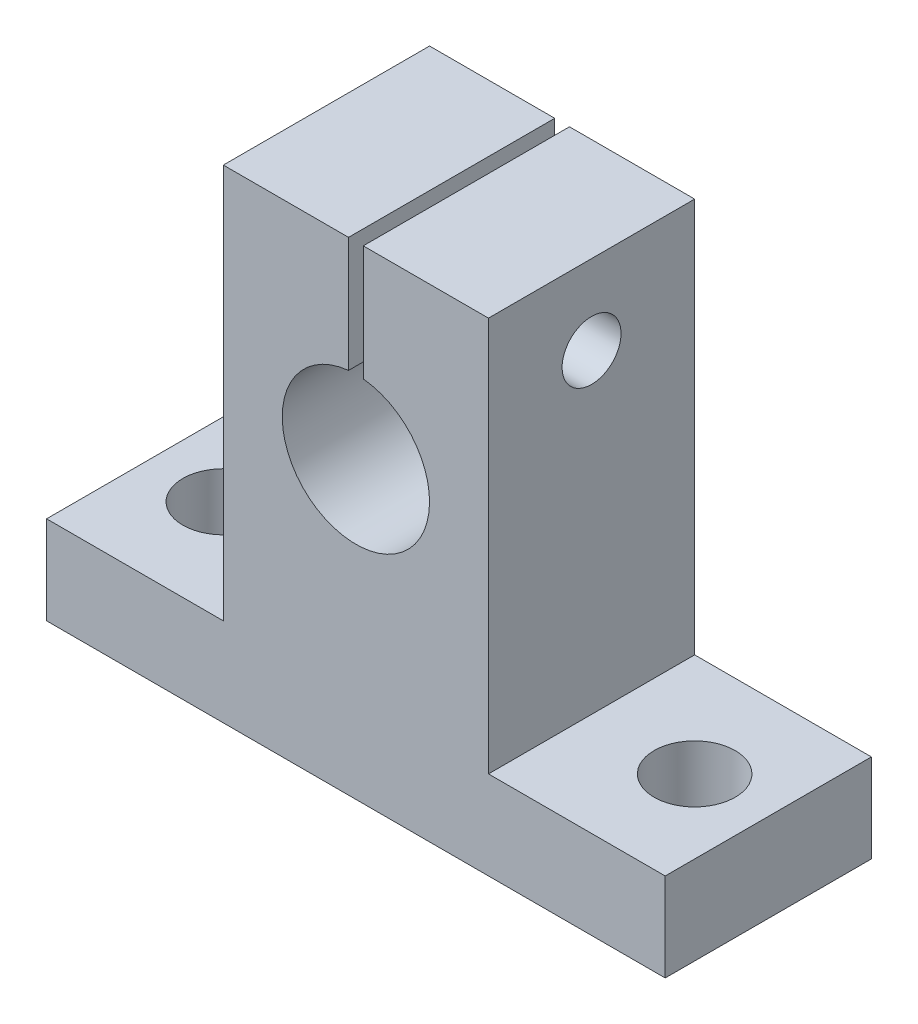
ISO-10303-21;
HEADER;
FILE_DESCRIPTION(('STEP AP214'),'2;1');
FILE_NAME('part.step','',(''),(''),'','','');
FILE_SCHEMA(('AUTOMOTIVE_DESIGN { 1 0 10303 214 1 1 1 1 }'));
ENDSEC;
DATA;
#1=APPLICATION_CONTEXT('core data for automotive mechanical design processes');
#2=APPLICATION_PROTOCOL_DEFINITION('international standard','automotive_design',2000,#1);
#3=PRODUCT_CONTEXT('',#1,'mechanical');
#4=PRODUCT('Part','Part','',(#3));
#5=PRODUCT_RELATED_PRODUCT_CATEGORY('part','',(#4));
#6=PRODUCT_DEFINITION_FORMATION('','',#4);
#7=PRODUCT_DEFINITION_CONTEXT('part definition',#1,'design');
#8=PRODUCT_DEFINITION('design','',#6,#7);
#9=PRODUCT_DEFINITION_SHAPE('','',#8);
#10=(LENGTH_UNIT() NAMED_UNIT(*) SI_UNIT(.MILLI.,.METRE.));
#11=(NAMED_UNIT(*) PLANE_ANGLE_UNIT() SI_UNIT($,.RADIAN.));
#12=(NAMED_UNIT(*) SI_UNIT($,.STERADIAN.) SOLID_ANGLE_UNIT());
#13=UNCERTAINTY_MEASURE_WITH_UNIT(LENGTH_MEASURE(1.E-05),#10,'distance_accuracy_value','');
#14=(GEOMETRIC_REPRESENTATION_CONTEXT(3) GLOBAL_UNCERTAINTY_ASSIGNED_CONTEXT((#13)) GLOBAL_UNIT_ASSIGNED_CONTEXT((#10,
#11,#12)) REPRESENTATION_CONTEXT('',''));
#15=CARTESIAN_POINT('',(0.,0.,0.));
#16=DIRECTION('',(0.,0.,1.));
#17=DIRECTION('',(1.,0.,0.));
#18=AXIS2_PLACEMENT_3D('',#15,#16,#17);
#19=CARTESIAN_POINT('',(-9.,13.4,7.));
#20=DIRECTION('',(0.,-1.,0.));
#21=DIRECTION('',(1.,0.,0.));
#22=AXIS2_PLACEMENT_3D('',#19,#20,#21);
#23=PLANE('',#22);
#24=DIRECTION('',(-1.,0.,0.));
#25=VECTOR('',#24,1.);
#26=CARTESIAN_POINT('',(-9.,13.4,7.));
#27=LINE('',#26,#25);
#28=CARTESIAN_POINT('',(-0.500000000000003,13.4,7.));
#29=VERTEX_POINT('',#28);
#30=CARTESIAN_POINT('',(-9.,13.4,7.));
#31=VERTEX_POINT('',#30);
#32=EDGE_CURVE('E214',#29,#31,#27,.T.);
#33=ORIENTED_EDGE('',*,*,#32,.F.);
#34=DIRECTION('',(0.,0.,-1.));
#35=VECTOR('',#34,1.);
#36=CARTESIAN_POINT('',(-0.500000000000002,13.4,7.));
#37=LINE('',#36,#35);
#38=CARTESIAN_POINT('',(-0.500000000000003,13.4,-7.));
#39=VERTEX_POINT('',#38);
#40=EDGE_CURVE('E129',#29,#39,#37,.T.);
#41=ORIENTED_EDGE('',*,*,#40,.T.);
#42=DIRECTION('',(-1.,0.,0.));
#43=VECTOR('',#42,1.);
#44=CARTESIAN_POINT('',(-9.,13.4,-7.));
#45=LINE('',#44,#43);
#46=CARTESIAN_POINT('',(-9.,13.4,-7.));
#47=VERTEX_POINT('',#46);
#48=EDGE_CURVE('E146',#39,#47,#45,.T.);
#49=ORIENTED_EDGE('',*,*,#48,.T.);
#50=DIRECTION('',(0.,0.,-1.));
#51=VECTOR('',#50,1.);
#52=CARTESIAN_POINT('',(-9.,13.4,7.));
#53=LINE('',#52,#51);
#54=EDGE_CURVE('E178',#31,#47,#53,.T.);
#55=ORIENTED_EDGE('',*,*,#54,.F.);
#56=EDGE_LOOP('',(#33,#41,#49,#55));
#57=FACE_BOUND('',#56,.T.);
#58=ADVANCED_FACE('F34',(#57),#23,.F.);
#59=CARTESIAN_POINT('',(0.,0.,7.));
#60=DIRECTION('',(0.,0.,-1.));
#61=DIRECTION('',(-1.,0.,0.));
#62=AXIS2_PLACEMENT_3D('',#59,#60,#61);
#63=PLANE('',#62);
#64=CARTESIAN_POINT('',(0.,0.6,7.));
#65=DIRECTION('',(0.,0.,1.));
#66=DIRECTION('',(1.,0.,0.));
#67=AXIS2_PLACEMENT_3D('',#64,#65,#66);
#68=CIRCLE('',#67,5.);
#69=CARTESIAN_POINT('',(-0.500000000000001,5.5749371855331,7.));
#70=VERTEX_POINT('',#69);
#71=CARTESIAN_POINT('',(0.499999999999999,5.5749371855331,7.));
#72=VERTEX_POINT('',#71);
#73=EDGE_CURVE('E198',#70,#72,#68,.T.);
#74=ORIENTED_EDGE('',*,*,#73,.F.);
#75=DIRECTION('',(0.,-1.,0.));
#76=VECTOR('',#75,1.);
#77=CARTESIAN_POINT('',(-0.500000000000004,16.5999271851901,7.));
#78=LINE('',#77,#76);
#79=EDGE_CURVE('E57',#29,#70,#78,.T.);
#80=ORIENTED_EDGE('',*,*,#79,.F.);
#81=ORIENTED_EDGE('',*,*,#32,.T.);
#82=DIRECTION('',(0.,-1.,0.));
#83=VECTOR('',#82,1.);
#84=CARTESIAN_POINT('',(-9.,13.4,7.));
#85=LINE('',#84,#83);
#86=CARTESIAN_POINT('',(-9.,-13.4,7.));
#87=VERTEX_POINT('',#86);
#88=EDGE_CURVE('E216',#31,#87,#85,.T.);
#89=ORIENTED_EDGE('',*,*,#88,.T.);
#90=DIRECTION('',(-1.,0.,0.));
#91=VECTOR('',#90,1.);
#92=CARTESIAN_POINT('',(-9.,-13.4,7.));
#93=LINE('',#92,#91);
#94=CARTESIAN_POINT('',(-21.,-13.4,7.));
#95=VERTEX_POINT('',#94);
#96=EDGE_CURVE('E218',#87,#95,#93,.T.);
#97=ORIENTED_EDGE('',*,*,#96,.T.);
#98=DIRECTION('',(0.,-1.,0.));
#99=VECTOR('',#98,1.);
#100=CARTESIAN_POINT('',(-21.,-13.4,7.));
#101=LINE('',#100,#99);
#102=CARTESIAN_POINT('',(-21.,-19.4,7.));
#103=VERTEX_POINT('',#102);
#104=EDGE_CURVE('E220',#95,#103,#101,.T.);
#105=ORIENTED_EDGE('',*,*,#104,.T.);
#106=DIRECTION('',(1.,0.,0.));
#107=VECTOR('',#106,1.);
#108=CARTESIAN_POINT('',(-21.,-19.4,7.));
#109=LINE('',#108,#107);
#110=CARTESIAN_POINT('',(21.,-19.4,7.));
#111=VERTEX_POINT('',#110);
#112=EDGE_CURVE('E222',#103,#111,#109,.T.);
#113=ORIENTED_EDGE('',*,*,#112,.T.);
#114=DIRECTION('',(0.,1.,0.));
#115=VECTOR('',#114,1.);
#116=CARTESIAN_POINT('',(21.,-13.4,7.));
#117=LINE('',#116,#115);
#118=CARTESIAN_POINT('',(21.,-13.4,7.));
#119=VERTEX_POINT('',#118);
#120=EDGE_CURVE('E166',#111,#119,#117,.T.);
#121=ORIENTED_EDGE('',*,*,#120,.T.);
#122=DIRECTION('',(-1.,0.,0.));
#123=VECTOR('',#122,1.);
#124=CARTESIAN_POINT('',(9.,-13.4,7.));
#125=LINE('',#124,#123);
#126=CARTESIAN_POINT('',(9.,-13.4,7.));
#127=VERTEX_POINT('',#126);
#128=EDGE_CURVE('E161',#119,#127,#125,.T.);
#129=ORIENTED_EDGE('',*,*,#128,.T.);
#130=DIRECTION('',(0.,1.,0.));
#131=VECTOR('',#130,1.);
#132=CARTESIAN_POINT('',(9.,13.4,7.));
#133=LINE('',#132,#131);
#134=CARTESIAN_POINT('',(9.,13.4,7.));
#135=VERTEX_POINT('',#134);
#136=EDGE_CURVE('E212',#127,#135,#133,.T.);
#137=ORIENTED_EDGE('',*,*,#136,.T.);
#138=CARTESIAN_POINT('',(0.499999999999997,13.4,7.));
#139=VERTEX_POINT('',#138);
#140=EDGE_CURVE('E199',#135,#139,#27,.T.);
#141=ORIENTED_EDGE('',*,*,#140,.T.);
#142=DIRECTION('',(0.,1.,0.));
#143=VECTOR('',#142,1.);
#144=CARTESIAN_POINT('',(0.499999999999996,16.5999271851901,7.));
#145=LINE('',#144,#143);
#146=EDGE_CURVE('E124',#72,#139,#145,.T.);
#147=ORIENTED_EDGE('',*,*,#146,.F.);
#148=EDGE_LOOP('',(#74,#80,#81,#89,#97,#105,#113,#121,#129,#137,#141,#147));
#149=FACE_BOUND('',#148,.T.);
#150=ADVANCED_FACE('F197',(#149),#63,.F.);
#151=CARTESIAN_POINT('',(0.,0.,-7.));
#152=DIRECTION('',(0.,0.,-1.));
#153=DIRECTION('',(-1.,0.,0.));
#154=AXIS2_PLACEMENT_3D('',#151,#152,#153);
#155=PLANE('',#154);
#156=DIRECTION('',(0.,-1.,0.));
#157=VECTOR('',#156,1.);
#158=CARTESIAN_POINT('',(-0.500000000000004,16.5999271851901,-7.));
#159=LINE('',#158,#157);
#160=CARTESIAN_POINT('',(-0.500000000000001,5.5749371855331,-7.));
#161=VERTEX_POINT('',#160);
#162=EDGE_CURVE('E139',#39,#161,#159,.T.);
#163=ORIENTED_EDGE('',*,*,#162,.T.);
#164=CARTESIAN_POINT('',(0.,0.6,-7.));
#165=DIRECTION('',(0.,0.,1.));
#166=DIRECTION('',(1.,0.,0.));
#167=AXIS2_PLACEMENT_3D('',#164,#165,#166);
#168=CIRCLE('',#167,5.);
#169=CARTESIAN_POINT('',(0.499999999999999,5.5749371855331,-7.));
#170=VERTEX_POINT('',#169);
#171=EDGE_CURVE('E138',#161,#170,#168,.T.);
#172=ORIENTED_EDGE('',*,*,#171,.T.);
#173=DIRECTION('',(0.,1.,0.));
#174=VECTOR('',#173,1.);
#175=CARTESIAN_POINT('',(0.499999999999996,16.5999271851901,-7.));
#176=LINE('',#175,#174);
#177=CARTESIAN_POINT('',(0.499999999999997,13.4,-7.));
#178=VERTEX_POINT('',#177);
#179=EDGE_CURVE('E50',#170,#178,#176,.T.);
#180=ORIENTED_EDGE('',*,*,#179,.T.);
#181=CARTESIAN_POINT('',(9.,13.4,-7.));
#182=VERTEX_POINT('',#181);
#183=EDGE_CURVE('E136',#182,#178,#45,.T.);
#184=ORIENTED_EDGE('',*,*,#183,.F.);
#185=DIRECTION('',(0.,1.,0.));
#186=VECTOR('',#185,1.);
#187=CARTESIAN_POINT('',(9.,13.4,-7.));
#188=LINE('',#187,#186);
#189=CARTESIAN_POINT('',(9.,-13.4,-7.));
#190=VERTEX_POINT('',#189);
#191=EDGE_CURVE('E150',#190,#182,#188,.T.);
#192=ORIENTED_EDGE('',*,*,#191,.F.);
#193=DIRECTION('',(-1.,0.,0.));
#194=VECTOR('',#193,1.);
#195=CARTESIAN_POINT('',(9.,-13.4,-7.));
#196=LINE('',#195,#194);
#197=CARTESIAN_POINT('',(21.,-13.4,-7.));
#198=VERTEX_POINT('',#197);
#199=EDGE_CURVE('E203',#198,#190,#196,.T.);
#200=ORIENTED_EDGE('',*,*,#199,.F.);
#201=DIRECTION('',(0.,1.,0.));
#202=VECTOR('',#201,1.);
#203=CARTESIAN_POINT('',(21.,-13.4,-7.));
#204=LINE('',#203,#202);
#205=CARTESIAN_POINT('',(21.,-19.4,-7.));
#206=VERTEX_POINT('',#205);
#207=EDGE_CURVE('E159',#206,#198,#204,.T.);
#208=ORIENTED_EDGE('',*,*,#207,.F.);
#209=DIRECTION('',(1.,0.,0.));
#210=VECTOR('',#209,1.);
#211=CARTESIAN_POINT('',(-21.,-19.4,-7.));
#212=LINE('',#211,#210);
#213=CARTESIAN_POINT('',(-21.,-19.4,-7.));
#214=VERTEX_POINT('',#213);
#215=EDGE_CURVE('E157',#214,#206,#212,.T.);
#216=ORIENTED_EDGE('',*,*,#215,.F.);
#217=DIRECTION('',(0.,-1.,0.));
#218=VECTOR('',#217,1.);
#219=CARTESIAN_POINT('',(-21.,-13.4,-7.));
#220=LINE('',#219,#218);
#221=CARTESIAN_POINT('',(-21.,-13.4,-7.));
#222=VERTEX_POINT('',#221);
#223=EDGE_CURVE('E155',#222,#214,#220,.T.);
#224=ORIENTED_EDGE('',*,*,#223,.F.);
#225=DIRECTION('',(-1.,0.,0.));
#226=VECTOR('',#225,1.);
#227=CARTESIAN_POINT('',(-9.,-13.4,-7.));
#228=LINE('',#227,#226);
#229=CARTESIAN_POINT('',(-9.,-13.4,-7.));
#230=VERTEX_POINT('',#229);
#231=EDGE_CURVE('E148',#230,#222,#228,.T.);
#232=ORIENTED_EDGE('',*,*,#231,.F.);
#233=DIRECTION('',(0.,-1.,0.));
#234=VECTOR('',#233,1.);
#235=CARTESIAN_POINT('',(-9.,13.4,-7.));
#236=LINE('',#235,#234);
#237=EDGE_CURVE('E145',#47,#230,#236,.T.);
#238=ORIENTED_EDGE('',*,*,#237,.F.);
#239=ORIENTED_EDGE('',*,*,#48,.F.);
#240=EDGE_LOOP('',(#163,#172,#180,#184,#192,#200,#208,#216,#224,#232,#238,#239));
#241=FACE_BOUND('',#240,.T.);
#242=ADVANCED_FACE('F135',(#241),#155,.T.);
#243=CARTESIAN_POINT('',(9.,-13.4,7.));
#244=DIRECTION('',(0.,-1.,0.));
#245=DIRECTION('',(1.,0.,0.));
#246=AXIS2_PLACEMENT_3D('',#243,#244,#245);
#247=PLANE('',#246);
#248=CARTESIAN_POINT('',(16.,-13.4,0.));
#249=DIRECTION('',(0.,1.,0.));
#250=DIRECTION('',(0.,0.,-1.));
#251=AXIS2_PLACEMENT_3D('',#248,#249,#250);
#252=CIRCLE('',#251,2.75);
#253=CARTESIAN_POINT('',(16.,-13.4,-2.75));
#254=VERTEX_POINT('',#253);
#255=EDGE_CURVE('E192',#254,#254,#252,.T.);
#256=ORIENTED_EDGE('',*,*,#255,.F.);
#257=EDGE_LOOP('',(#256));
#258=FACE_BOUND('',#257,.T.);
#259=ORIENTED_EDGE('',*,*,#199,.T.);
#260=DIRECTION('',(0.,0.,-1.));
#261=VECTOR('',#260,1.);
#262=CARTESIAN_POINT('',(9.,-13.4,7.));
#263=LINE('',#262,#261);
#264=EDGE_CURVE('E182',#127,#190,#263,.T.);
#265=ORIENTED_EDGE('',*,*,#264,.F.);
#266=ORIENTED_EDGE('',*,*,#128,.F.);
#267=DIRECTION('',(0.,0.,-1.));
#268=VECTOR('',#267,1.);
#269=CARTESIAN_POINT('',(21.,-13.4,7.));
#270=LINE('',#269,#268);
#271=EDGE_CURVE('E162',#119,#198,#270,.T.);
#272=ORIENTED_EDGE('',*,*,#271,.T.);
#273=EDGE_LOOP('',(#259,#265,#266,#272));
#274=FACE_BOUND('',#273,.T.);
#275=ADVANCED_FACE('F36',(#258,#274),#247,.F.);
#276=CARTESIAN_POINT('',(9.,13.4,7.));
#277=DIRECTION('',(-1.,0.,0.));
#278=DIRECTION('',(0.,-1.,0.));
#279=AXIS2_PLACEMENT_3D('',#276,#277,#278);
#280=PLANE('',#279);
#281=CARTESIAN_POINT('',(9.,8.,0.));
#282=DIRECTION('',(1.,0.,0.));
#283=DIRECTION('',(0.,1.,0.));
#284=AXIS2_PLACEMENT_3D('',#281,#282,#283);
#285=CIRCLE('',#284,2.);
#286=CARTESIAN_POINT('',(9.,10.,0.));
#287=VERTEX_POINT('',#286);
#288=EDGE_CURVE('E270',#287,#287,#285,.T.);
#289=ORIENTED_EDGE('',*,*,#288,.F.);
#290=EDGE_LOOP('',(#289));
#291=FACE_BOUND('',#290,.T.);
#292=ORIENTED_EDGE('',*,*,#191,.T.);
#293=DIRECTION('',(0.,0.,-1.));
#294=VECTOR('',#293,1.);
#295=CARTESIAN_POINT('',(9.,13.4,7.));
#296=LINE('',#295,#294);
#297=EDGE_CURVE('E144',#135,#182,#296,.T.);
#298=ORIENTED_EDGE('',*,*,#297,.F.);
#299=ORIENTED_EDGE('',*,*,#136,.F.);
#300=ORIENTED_EDGE('',*,*,#264,.T.);
#301=EDGE_LOOP('',(#292,#298,#299,#300));
#302=FACE_BOUND('',#301,.T.);
#303=ADVANCED_FACE('F236',(#291,#302),#280,.F.);
#304=ORIENTED_EDGE('',*,*,#183,.T.);
#305=DIRECTION('',(0.,0.,1.));
#306=VECTOR('',#305,1.);
#307=CARTESIAN_POINT('',(0.499999999999997,13.4,7.));
#308=LINE('',#307,#306);
#309=EDGE_CURVE('E121',#178,#139,#308,.T.);
#310=ORIENTED_EDGE('',*,*,#309,.T.);
#311=ORIENTED_EDGE('',*,*,#140,.F.);
#312=ORIENTED_EDGE('',*,*,#297,.T.);
#313=EDGE_LOOP('',(#304,#310,#311,#312));
#314=FACE_BOUND('',#313,.T.);
#315=ADVANCED_FACE('F142',(#314),#23,.F.);
#316=CARTESIAN_POINT('',(-9.,13.4,7.));
#317=DIRECTION('',(1.,0.,0.));
#318=DIRECTION('',(0.,1.,0.));
#319=AXIS2_PLACEMENT_3D('',#316,#317,#318);
#320=PLANE('',#319);
#321=CARTESIAN_POINT('',(-9.,8.,0.));
#322=DIRECTION('',(1.,0.,0.));
#323=DIRECTION('',(0.,1.,0.));
#324=AXIS2_PLACEMENT_3D('',#321,#322,#323);
#325=CIRCLE('',#324,2.);
#326=CARTESIAN_POINT('',(-9.,10.,0.));
#327=VERTEX_POINT('',#326);
#328=EDGE_CURVE('E200',#327,#327,#325,.T.);
#329=ORIENTED_EDGE('',*,*,#328,.T.);
#330=EDGE_LOOP('',(#329));
#331=FACE_BOUND('',#330,.T.);
#332=ORIENTED_EDGE('',*,*,#237,.T.);
#333=DIRECTION('',(0.,0.,-1.));
#334=VECTOR('',#333,1.);
#335=CARTESIAN_POINT('',(-9.,-13.4,7.));
#336=LINE('',#335,#334);
#337=EDGE_CURVE('E175',#87,#230,#336,.T.);
#338=ORIENTED_EDGE('',*,*,#337,.F.);
#339=ORIENTED_EDGE('',*,*,#88,.F.);
#340=ORIENTED_EDGE('',*,*,#54,.T.);
#341=EDGE_LOOP('',(#332,#338,#339,#340));
#342=FACE_BOUND('',#341,.T.);
#343=ADVANCED_FACE('F254',(#331,#342),#320,.F.);
#344=CARTESIAN_POINT('',(-9.,-13.4,7.));
#345=DIRECTION('',(0.,-1.,0.));
#346=DIRECTION('',(1.,0.,0.));
#347=AXIS2_PLACEMENT_3D('',#344,#345,#346);
#348=PLANE('',#347);
#349=CARTESIAN_POINT('',(-16.,-13.4,0.));
#350=DIRECTION('',(0.,1.,0.));
#351=DIRECTION('',(0.,0.,1.));
#352=AXIS2_PLACEMENT_3D('',#349,#350,#351);
#353=CIRCLE('',#352,2.75);
#354=CARTESIAN_POINT('',(-16.,-13.4,2.75));
#355=VERTEX_POINT('',#354);
#356=EDGE_CURVE('E188',#355,#355,#353,.T.);
#357=ORIENTED_EDGE('',*,*,#356,.F.);
#358=EDGE_LOOP('',(#357));
#359=FACE_BOUND('',#358,.T.);
#360=ORIENTED_EDGE('',*,*,#231,.T.);
#361=DIRECTION('',(0.,0.,-1.));
#362=VECTOR('',#361,1.);
#363=CARTESIAN_POINT('',(-21.,-13.4,7.));
#364=LINE('',#363,#362);
#365=EDGE_CURVE('E172',#95,#222,#364,.T.);
#366=ORIENTED_EDGE('',*,*,#365,.F.);
#367=ORIENTED_EDGE('',*,*,#96,.F.);
#368=ORIENTED_EDGE('',*,*,#337,.T.);
#369=EDGE_LOOP('',(#360,#366,#367,#368));
#370=FACE_BOUND('',#369,.T.);
#371=ADVANCED_FACE('F249',(#359,#370),#348,.F.);
#372=CARTESIAN_POINT('',(-21.,-13.4,7.));
#373=DIRECTION('',(1.,0.,0.));
#374=DIRECTION('',(0.,1.,0.));
#375=AXIS2_PLACEMENT_3D('',#372,#373,#374);
#376=PLANE('',#375);
#377=ORIENTED_EDGE('',*,*,#223,.T.);
#378=DIRECTION('',(0.,0.,-1.));
#379=VECTOR('',#378,1.);
#380=CARTESIAN_POINT('',(-21.,-19.4,7.));
#381=LINE('',#380,#379);
#382=EDGE_CURVE('E169',#103,#214,#381,.T.);
#383=ORIENTED_EDGE('',*,*,#382,.F.);
#384=ORIENTED_EDGE('',*,*,#104,.F.);
#385=ORIENTED_EDGE('',*,*,#365,.T.);
#386=EDGE_LOOP('',(#377,#383,#384,#385));
#387=FACE_BOUND('',#386,.T.);
#388=ADVANCED_FACE('F245',(#387),#376,.F.);
#389=CARTESIAN_POINT('',(-21.,-19.4,7.));
#390=DIRECTION('',(0.,1.,0.));
#391=DIRECTION('',(-1.,0.,0.));
#392=AXIS2_PLACEMENT_3D('',#389,#390,#391);
#393=PLANE('',#392);
#394=CARTESIAN_POINT('',(16.,-19.4,0.));
#395=DIRECTION('',(0.,1.,0.));
#396=DIRECTION('',(-1.,0.,0.));
#397=AXIS2_PLACEMENT_3D('',#394,#395,#396);
#398=CIRCLE('',#397,2.75);
#399=CARTESIAN_POINT('',(13.25,-19.4,0.));
#400=VERTEX_POINT('',#399);
#401=EDGE_CURVE('E189',#400,#400,#398,.T.);
#402=ORIENTED_EDGE('',*,*,#401,.T.);
#403=EDGE_LOOP('',(#402));
#404=FACE_BOUND('',#403,.T.);
#405=CARTESIAN_POINT('',(-16.,-19.4,0.));
#406=DIRECTION('',(0.,1.,0.));
#407=DIRECTION('',(-1.,0.,0.));
#408=AXIS2_PLACEMENT_3D('',#405,#406,#407);
#409=CIRCLE('',#408,2.75);
#410=CARTESIAN_POINT('',(-18.75,-19.4,0.));
#411=VERTEX_POINT('',#410);
#412=EDGE_CURVE('E185',#411,#411,#409,.T.);
#413=ORIENTED_EDGE('',*,*,#412,.T.);
#414=EDGE_LOOP('',(#413));
#415=FACE_BOUND('',#414,.T.);
#416=ORIENTED_EDGE('',*,*,#215,.T.);
#417=DIRECTION('',(0.,0.,-1.));
#418=VECTOR('',#417,1.);
#419=CARTESIAN_POINT('',(21.,-19.4,7.));
#420=LINE('',#419,#418);
#421=EDGE_CURVE('E165',#111,#206,#420,.T.);
#422=ORIENTED_EDGE('',*,*,#421,.F.);
#423=ORIENTED_EDGE('',*,*,#112,.F.);
#424=ORIENTED_EDGE('',*,*,#382,.T.);
#425=EDGE_LOOP('',(#416,#422,#423,#424));
#426=FACE_BOUND('',#425,.T.);
#427=ADVANCED_FACE('F241',(#404,#415,#426),#393,.F.);
#428=CARTESIAN_POINT('',(21.,-13.4,7.));
#429=DIRECTION('',(-1.,0.,0.));
#430=DIRECTION('',(0.,-1.,0.));
#431=AXIS2_PLACEMENT_3D('',#428,#429,#430);
#432=PLANE('',#431);
#433=ORIENTED_EDGE('',*,*,#207,.T.);
#434=ORIENTED_EDGE('',*,*,#271,.F.);
#435=ORIENTED_EDGE('',*,*,#120,.F.);
#436=ORIENTED_EDGE('',*,*,#421,.T.);
#437=EDGE_LOOP('',(#433,#434,#435,#436));
#438=FACE_BOUND('',#437,.T.);
#439=ADVANCED_FACE('F231',(#438),#432,.F.);
#440=CARTESIAN_POINT('',(0.,0.6,7.));
#441=DIRECTION('',(0.,0.,-1.));
#442=DIRECTION('',(-1.,0.,0.));
#443=AXIS2_PLACEMENT_3D('',#440,#441,#442);
#444=CYLINDRICAL_SURFACE('',#443,5.);
#445=DIRECTION('',(0.,0.,-1.));
#446=VECTOR('',#445,1.);
#447=CARTESIAN_POINT('',(-0.500000000000001,5.5749371855331,7.));
#448=LINE('',#447,#446);
#449=EDGE_CURVE('E11',#70,#161,#448,.T.);
#450=ORIENTED_EDGE('',*,*,#449,.F.);
#451=ORIENTED_EDGE('',*,*,#73,.T.);
#452=DIRECTION('',(0.,0.,-1.));
#453=VECTOR('',#452,1.);
#454=CARTESIAN_POINT('',(0.499999999999999,5.5749371855331,7.));
#455=LINE('',#454,#453);
#456=EDGE_CURVE('E43',#170,#72,#455,.F.);
#457=ORIENTED_EDGE('',*,*,#456,.F.);
#458=ORIENTED_EDGE('',*,*,#171,.F.);
#459=EDGE_LOOP('',(#450,#451,#457,#458));
#460=FACE_BOUND('',#459,.T.);
#461=ADVANCED_FACE('F202',(#460),#444,.F.);
#462=CARTESIAN_POINT('',(-16.,-23.4,0.));
#463=DIRECTION('',(0.,1.,0.));
#464=DIRECTION('',(0.,0.,1.));
#465=AXIS2_PLACEMENT_3D('',#462,#463,#464);
#466=CYLINDRICAL_SURFACE('',#465,2.75);
#467=ORIENTED_EDGE('',*,*,#356,.T.);
#468=EDGE_LOOP('',(#467));
#469=FACE_BOUND('',#468,.T.);
#470=ORIENTED_EDGE('',*,*,#412,.F.);
#471=EDGE_LOOP('',(#470));
#472=FACE_BOUND('',#471,.T.);
#473=ADVANCED_FACE('F315',(#469,#472),#466,.F.);
#474=CARTESIAN_POINT('',(16.,-23.4,0.));
#475=DIRECTION('',(0.,1.,0.));
#476=DIRECTION('',(0.,0.,1.));
#477=AXIS2_PLACEMENT_3D('',#474,#475,#476);
#478=CYLINDRICAL_SURFACE('',#477,2.75);
#479=ORIENTED_EDGE('',*,*,#255,.T.);
#480=EDGE_LOOP('',(#479));
#481=FACE_BOUND('',#480,.T.);
#482=ORIENTED_EDGE('',*,*,#401,.F.);
#483=EDGE_LOOP('',(#482));
#484=FACE_BOUND('',#483,.T.);
#485=ADVANCED_FACE('F312',(#481,#484),#478,.F.);
#486=CARTESIAN_POINT('',(0.499999999999996,16.5999271851901,-20.1778548882616));
#487=DIRECTION('',(1.,0.,0.));
#488=DIRECTION('',(0.,1.,0.));
#489=AXIS2_PLACEMENT_3D('',#486,#487,#488);
#490=PLANE('',#489);
#491=CARTESIAN_POINT('',(0.5,8.,0.));
#492=DIRECTION('',(1.,0.,0.));
#493=DIRECTION('',(0.,1.,0.));
#494=AXIS2_PLACEMENT_3D('',#491,#492,#493);
#495=CIRCLE('',#494,2.);
#496=CARTESIAN_POINT('',(0.5,10.,0.));
#497=VERTEX_POINT('',#496);
#498=EDGE_CURVE('E267',#497,#497,#495,.T.);
#499=ORIENTED_EDGE('',*,*,#498,.T.);
#500=EDGE_LOOP('',(#499));
#501=FACE_BOUND('',#500,.T.);
#502=ORIENTED_EDGE('',*,*,#179,.F.);
#503=ORIENTED_EDGE('',*,*,#456,.T.);
#504=ORIENTED_EDGE('',*,*,#146,.T.);
#505=ORIENTED_EDGE('',*,*,#309,.F.);
#506=EDGE_LOOP('',(#502,#503,#504,#505));
#507=FACE_BOUND('',#506,.T.);
#508=ADVANCED_FACE('F122',(#501,#507),#490,.F.);
#509=CARTESIAN_POINT('',(-0.500000000000004,16.5999271851901,-20.1778548882616));
#510=DIRECTION('',(-1.,0.,0.));
#511=DIRECTION('',(0.,-1.,0.));
#512=AXIS2_PLACEMENT_3D('',#509,#510,#511);
#513=PLANE('',#512);
#514=CARTESIAN_POINT('',(-0.5,8.,0.));
#515=DIRECTION('',(-1.,0.,0.));
#516=DIRECTION('',(0.,-1.,0.));
#517=AXIS2_PLACEMENT_3D('',#514,#515,#516);
#518=CIRCLE('',#517,2.);
#519=CARTESIAN_POINT('',(-0.5,6.,0.));
#520=VERTEX_POINT('',#519);
#521=EDGE_CURVE('E38',#520,#520,#518,.T.);
#522=ORIENTED_EDGE('',*,*,#521,.T.);
#523=EDGE_LOOP('',(#522));
#524=FACE_BOUND('',#523,.T.);
#525=ORIENTED_EDGE('',*,*,#79,.T.);
#526=ORIENTED_EDGE('',*,*,#449,.T.);
#527=ORIENTED_EDGE('',*,*,#162,.F.);
#528=ORIENTED_EDGE('',*,*,#40,.F.);
#529=EDGE_LOOP('',(#525,#526,#527,#528));
#530=FACE_BOUND('',#529,.T.);
#531=ADVANCED_FACE('F277',(#524,#530),#513,.F.);
#532=CARTESIAN_POINT('',(-21.,8.,0.));
#533=DIRECTION('',(1.,0.,0.));
#534=DIRECTION('',(0.,1.,0.));
#535=AXIS2_PLACEMENT_3D('',#532,#533,#534);
#536=CYLINDRICAL_SURFACE('',#535,2.);
#537=ORIENTED_EDGE('',*,*,#521,.F.);
#538=EDGE_LOOP('',(#537));
#539=FACE_BOUND('',#538,.T.);
#540=ORIENTED_EDGE('',*,*,#328,.F.);
#541=EDGE_LOOP('',(#540));
#542=FACE_BOUND('',#541,.T.);
#543=ADVANCED_FACE('F279',(#539,#542),#536,.F.);
#544=ORIENTED_EDGE('',*,*,#288,.T.);
#545=EDGE_LOOP('',(#544));
#546=FACE_BOUND('',#545,.T.);
#547=ORIENTED_EDGE('',*,*,#498,.F.);
#548=EDGE_LOOP('',(#547));
#549=FACE_BOUND('',#548,.T.);
#550=ADVANCED_FACE('F282',(#546,#549),#536,.F.);
#551=CLOSED_SHELL('',(#58,#150,#242,#275,#303,#315,#343,#371,#388,#427,#439,#461,#473,#485,#508,
#531,#543,#550));
#552=MANIFOLD_SOLID_BREP('B2',#551);
#553=ADVANCED_BREP_SHAPE_REPRESENTATION('',(#18,#552),#14);
#554=SHAPE_DEFINITION_REPRESENTATION(#9,#553);
ENDSEC;
END-ISO-10303-21;
